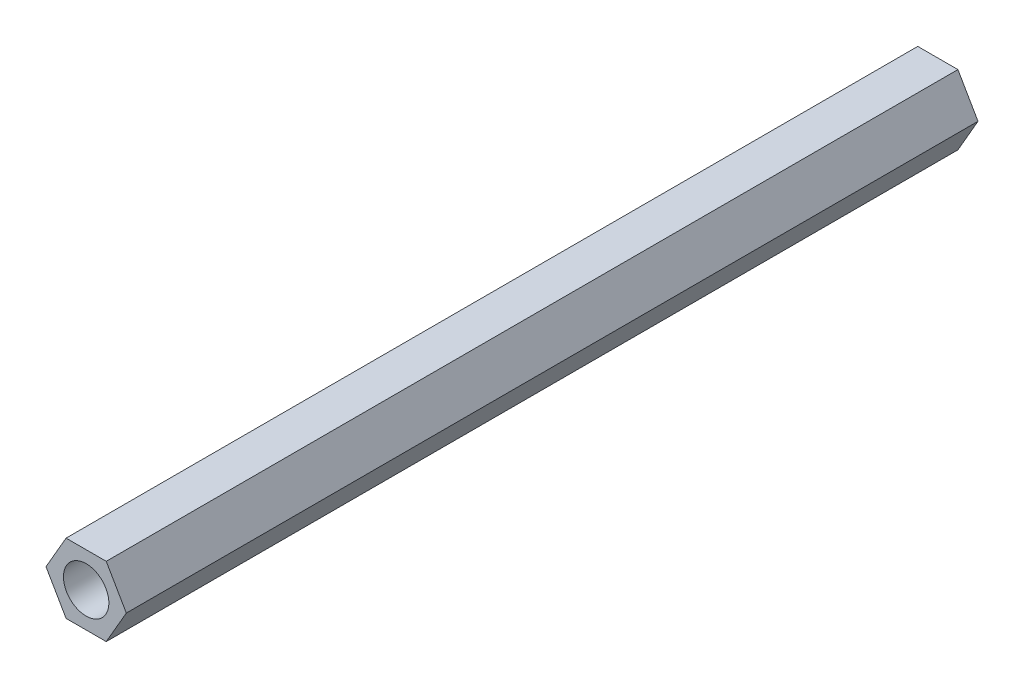
ISO-10303-21;
HEADER;
FILE_DESCRIPTION(('STEP AP214'),'2;1');
FILE_NAME('part.step','',(''),(''),'','','');
FILE_SCHEMA(('AUTOMOTIVE_DESIGN { 1 0 10303 214 1 1 1 1 }'));
ENDSEC;
DATA;
#1=APPLICATION_CONTEXT('core data for automotive mechanical design processes');
#2=APPLICATION_PROTOCOL_DEFINITION('international standard','automotive_design',2000,#1);
#3=PRODUCT_CONTEXT('',#1,'mechanical');
#4=PRODUCT('Part','Part','',(#3));
#5=PRODUCT_RELATED_PRODUCT_CATEGORY('part','',(#4));
#6=PRODUCT_DEFINITION_FORMATION('','',#4);
#7=PRODUCT_DEFINITION_CONTEXT('part definition',#1,'design');
#8=PRODUCT_DEFINITION('design','',#6,#7);
#9=PRODUCT_DEFINITION_SHAPE('','',#8);
#10=(LENGTH_UNIT() NAMED_UNIT(*) SI_UNIT(.MILLI.,.METRE.));
#11=(NAMED_UNIT(*) PLANE_ANGLE_UNIT() SI_UNIT($,.RADIAN.));
#12=(NAMED_UNIT(*) SI_UNIT($,.STERADIAN.) SOLID_ANGLE_UNIT());
#13=UNCERTAINTY_MEASURE_WITH_UNIT(LENGTH_MEASURE(1.E-05),#10,'distance_accuracy_value','');
#14=(GEOMETRIC_REPRESENTATION_CONTEXT(3) GLOBAL_UNCERTAINTY_ASSIGNED_CONTEXT((#13)) GLOBAL_UNIT_ASSIGNED_CONTEXT((#10,
#11,#12)) REPRESENTATION_CONTEXT('',''));
#15=CARTESIAN_POINT('',(0.,0.,0.));
#16=DIRECTION('',(0.,0.,1.));
#17=DIRECTION('',(1.,0.,0.));
#18=AXIS2_PLACEMENT_3D('',#15,#16,#17);
#19=CARTESIAN_POINT('',(0.,0.,60.));
#20=DIRECTION('',(0.,0.,1.));
#21=DIRECTION('',(1.,0.,0.));
#22=AXIS2_PLACEMENT_3D('',#19,#20,#21);
#23=PLANE('',#22);
#24=DIRECTION('',(0.5,0.866025403784439,0.));
#25=VECTOR('',#24,1.);
#26=CARTESIAN_POINT('',(1.41450815951458,-2.45,60.));
#27=LINE('',#26,#25);
#28=CARTESIAN_POINT('',(1.41450815951458,-2.45,60.));
#29=VERTEX_POINT('',#28);
#30=CARTESIAN_POINT('',(2.82901631902917,0.,60.));
#31=VERTEX_POINT('',#30);
#32=EDGE_CURVE('E129',#29,#31,#27,.T.);
#33=ORIENTED_EDGE('',*,*,#32,.T.);
#34=DIRECTION('',(-0.5,0.866025403784439,0.));
#35=VECTOR('',#34,1.);
#36=CARTESIAN_POINT('',(2.82901631902917,0.,60.));
#37=LINE('',#36,#35);
#38=CARTESIAN_POINT('',(1.41450815951458,2.45,60.));
#39=VERTEX_POINT('',#38);
#40=EDGE_CURVE('E87',#31,#39,#37,.T.);
#41=ORIENTED_EDGE('',*,*,#40,.T.);
#42=DIRECTION('',(-1.,0.,0.));
#43=VECTOR('',#42,1.);
#44=CARTESIAN_POINT('',(1.41450815951458,2.45,60.));
#45=LINE('',#44,#43);
#46=CARTESIAN_POINT('',(-1.41450815951458,2.45,60.));
#47=VERTEX_POINT('',#46);
#48=EDGE_CURVE('E100',#39,#47,#45,.T.);
#49=ORIENTED_EDGE('',*,*,#48,.T.);
#50=DIRECTION('',(-0.5,-0.866025403784439,0.));
#51=VECTOR('',#50,1.);
#52=CARTESIAN_POINT('',(-1.41450815951458,2.45,60.));
#53=LINE('',#52,#51);
#54=CARTESIAN_POINT('',(-2.82901631902917,0.,60.));
#55=VERTEX_POINT('',#54);
#56=EDGE_CURVE('E94',#47,#55,#53,.T.);
#57=ORIENTED_EDGE('',*,*,#56,.T.);
#58=DIRECTION('',(0.5,-0.866025403784439,0.));
#59=VECTOR('',#58,1.);
#60=CARTESIAN_POINT('',(-2.82901631902917,0.,60.));
#61=LINE('',#60,#59);
#62=CARTESIAN_POINT('',(-1.41450815951458,-2.45,60.));
#63=VERTEX_POINT('',#62);
#64=EDGE_CURVE('E98',#55,#63,#61,.T.);
#65=ORIENTED_EDGE('',*,*,#64,.T.);
#66=DIRECTION('',(1.,0.,0.));
#67=VECTOR('',#66,1.);
#68=CARTESIAN_POINT('',(-1.41450815951458,-2.45,60.));
#69=LINE('',#68,#67);
#70=EDGE_CURVE('E50',#63,#29,#69,.T.);
#71=ORIENTED_EDGE('',*,*,#70,.T.);
#72=EDGE_LOOP('',(#33,#41,#49,#57,#65,#71));
#73=FACE_BOUND('',#72,.T.);
#74=CARTESIAN_POINT('',(0.,0.,60.));
#75=DIRECTION('',(0.,0.,1.));
#76=DIRECTION('',(1.,0.,0.));
#77=AXIS2_PLACEMENT_3D('',#74,#75,#76);
#78=CIRCLE('',#77,1.6);
#79=CARTESIAN_POINT('',(1.6,0.,60.));
#80=VERTEX_POINT('',#79);
#81=EDGE_CURVE('E122',#80,#80,#78,.T.);
#82=ORIENTED_EDGE('',*,*,#81,.F.);
#83=EDGE_LOOP('',(#82));
#84=FACE_BOUND('',#83,.T.);
#85=ADVANCED_FACE('F33',(#73,#84),#23,.T.);
#86=CARTESIAN_POINT('',(0.,0.,0.));
#87=DIRECTION('',(0.,0.,1.));
#88=DIRECTION('',(1.,0.,0.));
#89=AXIS2_PLACEMENT_3D('',#86,#87,#88);
#90=PLANE('',#89);
#91=DIRECTION('',(0.5,0.866025403784439,0.));
#92=VECTOR('',#91,1.);
#93=CARTESIAN_POINT('',(1.41450815951458,-2.45,0.));
#94=LINE('',#93,#92);
#95=CARTESIAN_POINT('',(1.41450815951458,-2.45,0.));
#96=VERTEX_POINT('',#95);
#97=CARTESIAN_POINT('',(2.82901631902917,0.,0.));
#98=VERTEX_POINT('',#97);
#99=EDGE_CURVE('E118',#96,#98,#94,.T.);
#100=ORIENTED_EDGE('',*,*,#99,.F.);
#101=DIRECTION('',(1.,0.,0.));
#102=VECTOR('',#101,1.);
#103=CARTESIAN_POINT('',(-1.41450815951458,-2.45,0.));
#104=LINE('',#103,#102);
#105=CARTESIAN_POINT('',(-1.41450815951458,-2.45,0.));
#106=VERTEX_POINT('',#105);
#107=EDGE_CURVE('E79',#106,#96,#104,.T.);
#108=ORIENTED_EDGE('',*,*,#107,.F.);
#109=DIRECTION('',(0.5,-0.866025403784439,0.));
#110=VECTOR('',#109,1.);
#111=CARTESIAN_POINT('',(-2.82901631902917,0.,0.));
#112=LINE('',#111,#110);
#113=CARTESIAN_POINT('',(-2.82901631902917,0.,0.));
#114=VERTEX_POINT('',#113);
#115=EDGE_CURVE('E73',#114,#106,#112,.T.);
#116=ORIENTED_EDGE('',*,*,#115,.F.);
#117=DIRECTION('',(-0.5,-0.866025403784439,0.));
#118=VECTOR('',#117,1.);
#119=CARTESIAN_POINT('',(-1.41450815951458,2.45,0.));
#120=LINE('',#119,#118);
#121=CARTESIAN_POINT('',(-1.41450815951458,2.45,0.));
#122=VERTEX_POINT('',#121);
#123=EDGE_CURVE('E108',#122,#114,#120,.T.);
#124=ORIENTED_EDGE('',*,*,#123,.F.);
#125=DIRECTION('',(-1.,0.,0.));
#126=VECTOR('',#125,1.);
#127=CARTESIAN_POINT('',(1.41450815951458,2.45,0.));
#128=LINE('',#127,#126);
#129=CARTESIAN_POINT('',(1.41450815951458,2.45,0.));
#130=VERTEX_POINT('',#129);
#131=EDGE_CURVE('E124',#130,#122,#128,.T.);
#132=ORIENTED_EDGE('',*,*,#131,.F.);
#133=DIRECTION('',(-0.5,0.866025403784439,0.));
#134=VECTOR('',#133,1.);
#135=CARTESIAN_POINT('',(2.82901631902917,0.,0.));
#136=LINE('',#135,#134);
#137=EDGE_CURVE('E121',#98,#130,#136,.T.);
#138=ORIENTED_EDGE('',*,*,#137,.F.);
#139=EDGE_LOOP('',(#100,#108,#116,#124,#132,#138));
#140=FACE_BOUND('',#139,.T.);
#141=CARTESIAN_POINT('',(0.,0.,0.));
#142=DIRECTION('',(0.,0.,1.));
#143=DIRECTION('',(1.,0.,0.));
#144=AXIS2_PLACEMENT_3D('',#141,#142,#143);
#145=CIRCLE('',#144,1.6);
#146=CARTESIAN_POINT('',(1.6,0.,0.));
#147=VERTEX_POINT('',#146);
#148=EDGE_CURVE('E222',#147,#147,#145,.T.);
#149=ORIENTED_EDGE('',*,*,#148,.T.);
#150=EDGE_LOOP('',(#149));
#151=FACE_BOUND('',#150,.T.);
#152=ADVANCED_FACE('F138',(#140,#151),#90,.F.);
#153=CARTESIAN_POINT('',(1.41450815951458,-2.45,60.));
#154=DIRECTION('',(-0.866025403784439,0.5,0.));
#155=DIRECTION('',(-0.5,-0.866025403784439,0.));
#156=AXIS2_PLACEMENT_3D('',#153,#154,#155);
#157=PLANE('',#156);
#158=ORIENTED_EDGE('',*,*,#99,.T.);
#159=DIRECTION('',(0.,0.,-1.));
#160=VECTOR('',#159,1.);
#161=CARTESIAN_POINT('',(2.82901631902917,0.,60.));
#162=LINE('',#161,#160);
#163=EDGE_CURVE('E11',#31,#98,#162,.T.);
#164=ORIENTED_EDGE('',*,*,#163,.F.);
#165=ORIENTED_EDGE('',*,*,#32,.F.);
#166=DIRECTION('',(0.,0.,-1.));
#167=VECTOR('',#166,1.);
#168=CARTESIAN_POINT('',(1.41450815951458,-2.45,60.));
#169=LINE('',#168,#167);
#170=EDGE_CURVE('E114',#29,#96,#169,.T.);
#171=ORIENTED_EDGE('',*,*,#170,.T.);
#172=EDGE_LOOP('',(#158,#164,#165,#171));
#173=FACE_BOUND('',#172,.T.);
#174=ADVANCED_FACE('F35',(#173),#157,.F.);
#175=CARTESIAN_POINT('',(2.82901631902917,0.,60.));
#176=DIRECTION('',(-0.866025403784439,-0.5,0.));
#177=DIRECTION('',(0.5,-0.866025403784439,0.));
#178=AXIS2_PLACEMENT_3D('',#175,#176,#177);
#179=PLANE('',#178);
#180=ORIENTED_EDGE('',*,*,#137,.T.);
#181=DIRECTION('',(0.,0.,-1.));
#182=VECTOR('',#181,1.);
#183=CARTESIAN_POINT('',(1.41450815951458,2.45,60.));
#184=LINE('',#183,#182);
#185=EDGE_CURVE('E42',#39,#130,#184,.T.);
#186=ORIENTED_EDGE('',*,*,#185,.F.);
#187=ORIENTED_EDGE('',*,*,#40,.F.);
#188=ORIENTED_EDGE('',*,*,#163,.T.);
#189=EDGE_LOOP('',(#180,#186,#187,#188));
#190=FACE_BOUND('',#189,.T.);
#191=ADVANCED_FACE('F163',(#190),#179,.F.);
#192=CARTESIAN_POINT('',(1.41450815951458,2.45,60.));
#193=DIRECTION('',(0.,-1.,0.));
#194=DIRECTION('',(0.,0.,-1.));
#195=AXIS2_PLACEMENT_3D('',#192,#193,#194);
#196=PLANE('',#195);
#197=ORIENTED_EDGE('',*,*,#131,.T.);
#198=DIRECTION('',(0.,0.,-1.));
#199=VECTOR('',#198,1.);
#200=CARTESIAN_POINT('',(-1.41450815951458,2.45,60.));
#201=LINE('',#200,#199);
#202=EDGE_CURVE('E109',#47,#122,#201,.T.);
#203=ORIENTED_EDGE('',*,*,#202,.F.);
#204=ORIENTED_EDGE('',*,*,#48,.F.);
#205=ORIENTED_EDGE('',*,*,#185,.T.);
#206=EDGE_LOOP('',(#197,#203,#204,#205));
#207=FACE_BOUND('',#206,.T.);
#208=ADVANCED_FACE('F135',(#207),#196,.F.);
#209=CARTESIAN_POINT('',(-1.41450815951458,2.45,60.));
#210=DIRECTION('',(0.866025403784438,-0.5,0.));
#211=DIRECTION('',(0.5,0.866025403784439,0.));
#212=AXIS2_PLACEMENT_3D('',#209,#210,#211);
#213=PLANE('',#212);
#214=ORIENTED_EDGE('',*,*,#123,.T.);
#215=DIRECTION('',(0.,0.,-1.));
#216=VECTOR('',#215,1.);
#217=CARTESIAN_POINT('',(-2.82901631902917,0.,60.));
#218=LINE('',#217,#216);
#219=EDGE_CURVE('E105',#55,#114,#218,.T.);
#220=ORIENTED_EDGE('',*,*,#219,.F.);
#221=ORIENTED_EDGE('',*,*,#56,.F.);
#222=ORIENTED_EDGE('',*,*,#202,.T.);
#223=EDGE_LOOP('',(#214,#220,#221,#222));
#224=FACE_BOUND('',#223,.T.);
#225=ADVANCED_FACE('F106',(#224),#213,.F.);
#226=CARTESIAN_POINT('',(-2.82901631902917,0.,60.));
#227=DIRECTION('',(0.866025403784438,0.5,0.));
#228=DIRECTION('',(-0.5,0.866025403784439,0.));
#229=AXIS2_PLACEMENT_3D('',#226,#227,#228);
#230=PLANE('',#229);
#231=ORIENTED_EDGE('',*,*,#115,.T.);
#232=DIRECTION('',(0.,0.,-1.));
#233=VECTOR('',#232,1.);
#234=CARTESIAN_POINT('',(-1.41450815951458,-2.45,60.));
#235=LINE('',#234,#233);
#236=EDGE_CURVE('E110',#63,#106,#235,.T.);
#237=ORIENTED_EDGE('',*,*,#236,.F.);
#238=ORIENTED_EDGE('',*,*,#64,.F.);
#239=ORIENTED_EDGE('',*,*,#219,.T.);
#240=EDGE_LOOP('',(#231,#237,#238,#239));
#241=FACE_BOUND('',#240,.T.);
#242=ADVANCED_FACE('F112',(#241),#230,.F.);
#243=CARTESIAN_POINT('',(-1.41450815951458,-2.45,60.));
#244=DIRECTION('',(0.,1.,0.));
#245=DIRECTION('',(0.,0.,1.));
#246=AXIS2_PLACEMENT_3D('',#243,#244,#245);
#247=PLANE('',#246);
#248=ORIENTED_EDGE('',*,*,#107,.T.);
#249=ORIENTED_EDGE('',*,*,#170,.F.);
#250=ORIENTED_EDGE('',*,*,#70,.F.);
#251=ORIENTED_EDGE('',*,*,#236,.T.);
#252=EDGE_LOOP('',(#248,#249,#250,#251));
#253=FACE_BOUND('',#252,.T.);
#254=ADVANCED_FACE('F143',(#253),#247,.F.);
#255=CARTESIAN_POINT('',(0.,0.,60.));
#256=DIRECTION('',(0.,0.,-1.));
#257=DIRECTION('',(-1.,0.,0.));
#258=AXIS2_PLACEMENT_3D('',#255,#256,#257);
#259=CYLINDRICAL_SURFACE('',#258,1.6);
#260=ORIENTED_EDGE('',*,*,#81,.T.);
#261=EDGE_LOOP('',(#260));
#262=FACE_BOUND('',#261,.T.);
#263=ORIENTED_EDGE('',*,*,#148,.F.);
#264=EDGE_LOOP('',(#263));
#265=FACE_BOUND('',#264,.T.);
#266=ADVANCED_FACE('F145',(#262,#265),#259,.F.);
#267=CLOSED_SHELL('',(#85,#152,#174,#191,#208,#225,#242,#254,#266));
#268=MANIFOLD_SOLID_BREP('B2',#267);
#269=ADVANCED_BREP_SHAPE_REPRESENTATION('',(#18,#268),#14);
#270=SHAPE_DEFINITION_REPRESENTATION(#9,#269);
ENDSEC;
END-ISO-10303-21;
